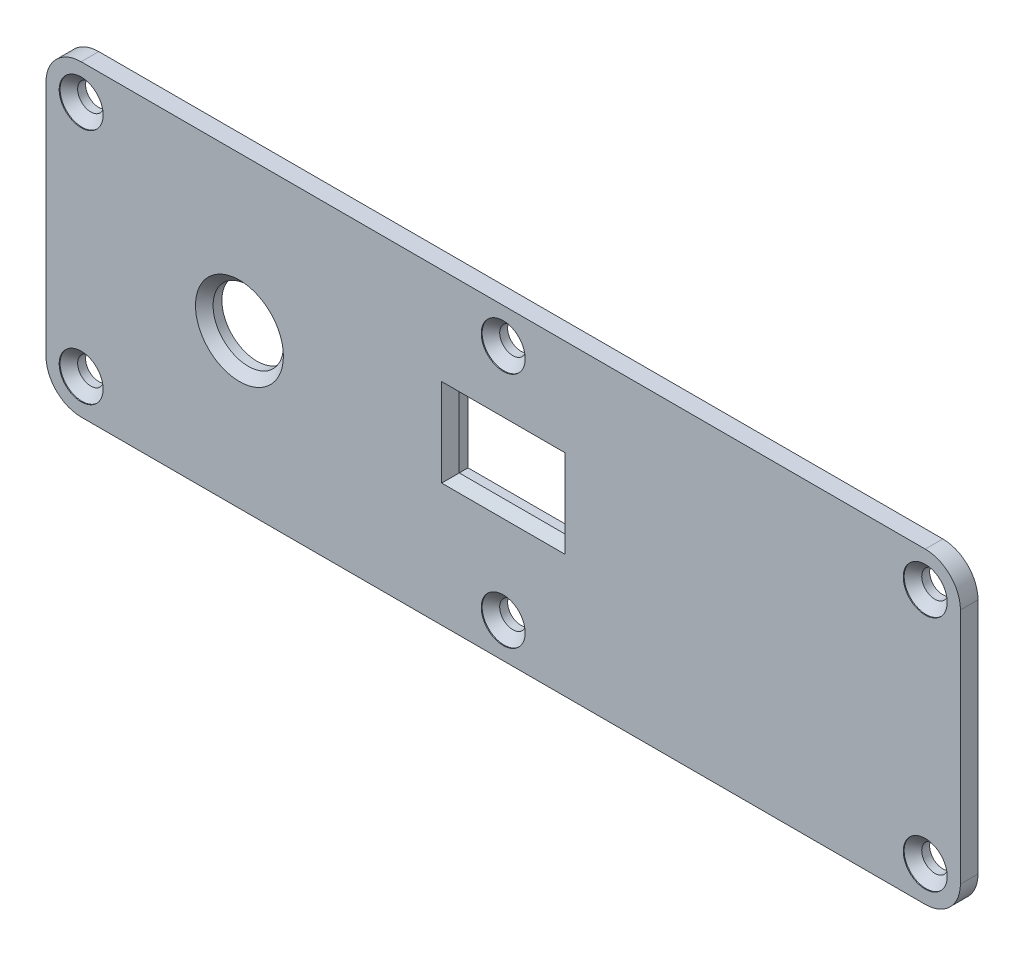
ISO-10303-21;
HEADER;
FILE_DESCRIPTION(('STEP AP214'),'2;1');
FILE_NAME('part.step','',(''),(''),'','','');
FILE_SCHEMA(('AUTOMOTIVE_DESIGN { 1 0 10303 214 1 1 1 1 }'));
ENDSEC;
DATA;
#1=APPLICATION_CONTEXT('core data for automotive mechanical design processes');
#2=APPLICATION_PROTOCOL_DEFINITION('international standard','automotive_design',2000,#1);
#3=PRODUCT_CONTEXT('',#1,'mechanical');
#4=PRODUCT('Part','Part','',(#3));
#5=PRODUCT_RELATED_PRODUCT_CATEGORY('part','',(#4));
#6=PRODUCT_DEFINITION_FORMATION('','',#4);
#7=PRODUCT_DEFINITION_CONTEXT('part definition',#1,'design');
#8=PRODUCT_DEFINITION('design','',#6,#7);
#9=PRODUCT_DEFINITION_SHAPE('','',#8);
#10=(LENGTH_UNIT() NAMED_UNIT(*) SI_UNIT(.MILLI.,.METRE.));
#11=(NAMED_UNIT(*) PLANE_ANGLE_UNIT() SI_UNIT($,.RADIAN.));
#12=(NAMED_UNIT(*) SI_UNIT($,.STERADIAN.) SOLID_ANGLE_UNIT());
#13=UNCERTAINTY_MEASURE_WITH_UNIT(LENGTH_MEASURE(1.E-05),#10,'distance_accuracy_value','');
#14=(GEOMETRIC_REPRESENTATION_CONTEXT(3) GLOBAL_UNCERTAINTY_ASSIGNED_CONTEXT((#13)) GLOBAL_UNIT_ASSIGNED_CONTEXT((#10,
#11,#12)) REPRESENTATION_CONTEXT('',''));
#15=CARTESIAN_POINT('',(0.,0.,0.));
#16=DIRECTION('',(0.,0.,1.));
#17=DIRECTION('',(1.,0.,0.));
#18=AXIS2_PLACEMENT_3D('',#15,#16,#17);
#19=CARTESIAN_POINT('',(-52.,4.00000000000001,0.));
#20=DIRECTION('',(0.,0.,1.));
#21=DIRECTION('',(1.,0.,0.));
#22=AXIS2_PLACEMENT_3D('',#19,#20,#21);
#23=CYLINDRICAL_SURFACE('',#22,1.5);
#24=CARTESIAN_POINT('',(-52.,4.00000000000001,0.900000000000003));
#25=DIRECTION('',(0.,0.,1.));
#26=DIRECTION('',(1.,0.,0.));
#27=AXIS2_PLACEMENT_3D('',#24,#25,#26);
#28=CIRCLE('',#27,1.5);
#29=CARTESIAN_POINT('',(-50.5,4.00000000000001,0.900000000000003));
#30=VERTEX_POINT('',#29);
#31=EDGE_CURVE('E260',#30,#30,#28,.T.);
#32=ORIENTED_EDGE('',*,*,#31,.T.);
#33=EDGE_LOOP('',(#32));
#34=FACE_BOUND('',#33,.T.);
#35=CARTESIAN_POINT('',(-52.,4.00000000000001,0.));
#36=DIRECTION('',(0.,0.,1.));
#37=DIRECTION('',(1.,0.,0.));
#38=AXIS2_PLACEMENT_3D('',#35,#36,#37);
#39=CIRCLE('',#38,1.5);
#40=CARTESIAN_POINT('',(-50.5,4.00000000000001,0.));
#41=VERTEX_POINT('',#40);
#42=EDGE_CURVE('E173',#41,#41,#39,.T.);
#43=ORIENTED_EDGE('',*,*,#42,.F.);
#44=EDGE_LOOP('',(#43));
#45=FACE_BOUND('',#44,.T.);
#46=ADVANCED_FACE('F32',(#34,#45),#23,.F.);
#47=CARTESIAN_POINT('',(-52.,31.,0.));
#48=DIRECTION('',(0.,0.,1.));
#49=DIRECTION('',(1.,0.,0.));
#50=AXIS2_PLACEMENT_3D('',#47,#48,#49);
#51=CYLINDRICAL_SURFACE('',#50,1.5);
#52=CARTESIAN_POINT('',(-52.,31.,0.899999999999989));
#53=DIRECTION('',(0.,0.,1.));
#54=DIRECTION('',(1.,0.,0.));
#55=AXIS2_PLACEMENT_3D('',#52,#53,#54);
#56=CIRCLE('',#55,1.5);
#57=CARTESIAN_POINT('',(-50.5,31.,0.899999999999989));
#58=VERTEX_POINT('',#57);
#59=EDGE_CURVE('E263',#58,#58,#56,.T.);
#60=ORIENTED_EDGE('',*,*,#59,.T.);
#61=EDGE_LOOP('',(#60));
#62=FACE_BOUND('',#61,.T.);
#63=CARTESIAN_POINT('',(-52.,31.,0.));
#64=DIRECTION('',(0.,0.,1.));
#65=DIRECTION('',(1.,0.,0.));
#66=AXIS2_PLACEMENT_3D('',#63,#64,#65);
#67=CIRCLE('',#66,1.5);
#68=CARTESIAN_POINT('',(-50.5,31.,0.));
#69=VERTEX_POINT('',#68);
#70=EDGE_CURVE('E183',#69,#69,#67,.T.);
#71=ORIENTED_EDGE('',*,*,#70,.F.);
#72=EDGE_LOOP('',(#71));
#73=FACE_BOUND('',#72,.T.);
#74=ADVANCED_FACE('F340',(#62,#73),#51,.F.);
#75=CARTESIAN_POINT('',(-100.,31.,0.));
#76=DIRECTION('',(0.,0.,1.));
#77=DIRECTION('',(1.,0.,0.));
#78=AXIS2_PLACEMENT_3D('',#75,#76,#77);
#79=CYLINDRICAL_SURFACE('',#78,1.5);
#80=CARTESIAN_POINT('',(-100.,31.,0.899999999999976));
#81=DIRECTION('',(0.,0.,1.));
#82=DIRECTION('',(1.,0.,0.));
#83=AXIS2_PLACEMENT_3D('',#80,#81,#82);
#84=CIRCLE('',#83,1.5);
#85=CARTESIAN_POINT('',(-98.5,31.,0.899999999999976));
#86=VERTEX_POINT('',#85);
#87=EDGE_CURVE('E257',#86,#86,#84,.T.);
#88=ORIENTED_EDGE('',*,*,#87,.T.);
#89=EDGE_LOOP('',(#88));
#90=FACE_BOUND('',#89,.T.);
#91=CARTESIAN_POINT('',(-100.,31.,0.));
#92=DIRECTION('',(0.,0.,1.));
#93=DIRECTION('',(1.,0.,0.));
#94=AXIS2_PLACEMENT_3D('',#91,#92,#93);
#95=CIRCLE('',#94,1.5);
#96=CARTESIAN_POINT('',(-98.5,31.,0.));
#97=VERTEX_POINT('',#96);
#98=EDGE_CURVE('E216',#97,#97,#95,.T.);
#99=ORIENTED_EDGE('',*,*,#98,.F.);
#100=EDGE_LOOP('',(#99));
#101=FACE_BOUND('',#100,.T.);
#102=ADVANCED_FACE('F346',(#90,#101),#79,.F.);
#103=CARTESIAN_POINT('',(-100.,3.99999999999999,0.));
#104=DIRECTION('',(0.,0.,1.));
#105=DIRECTION('',(1.,0.,0.));
#106=AXIS2_PLACEMENT_3D('',#103,#104,#105);
#107=CYLINDRICAL_SURFACE('',#106,1.5);
#108=CARTESIAN_POINT('',(-100.,3.99999999999999,0.89999999999999));
#109=DIRECTION('',(0.,0.,1.));
#110=DIRECTION('',(1.,0.,0.));
#111=AXIS2_PLACEMENT_3D('',#108,#109,#110);
#112=CIRCLE('',#111,1.5);
#113=CARTESIAN_POINT('',(-98.5,3.99999999999999,0.89999999999999));
#114=VERTEX_POINT('',#113);
#115=EDGE_CURVE('E254',#114,#114,#112,.T.);
#116=ORIENTED_EDGE('',*,*,#115,.T.);
#117=EDGE_LOOP('',(#116));
#118=FACE_BOUND('',#117,.T.);
#119=CARTESIAN_POINT('',(-100.,3.99999999999999,0.));
#120=DIRECTION('',(0.,0.,1.));
#121=DIRECTION('',(1.,0.,0.));
#122=AXIS2_PLACEMENT_3D('',#119,#120,#121);
#123=CIRCLE('',#122,1.5);
#124=CARTESIAN_POINT('',(-98.5,3.99999999999999,0.));
#125=VERTEX_POINT('',#124);
#126=EDGE_CURVE('E213',#125,#125,#123,.T.);
#127=ORIENTED_EDGE('',*,*,#126,.F.);
#128=EDGE_LOOP('',(#127));
#129=FACE_BOUND('',#128,.T.);
#130=ADVANCED_FACE('F370',(#118,#129),#107,.F.);
#131=CARTESIAN_POINT('',(0.,0.,2.));
#132=DIRECTION('',(-1.,0.,0.));
#133=DIRECTION('',(0.,0.,1.));
#134=AXIS2_PLACEMENT_3D('',#131,#132,#133);
#135=PLANE('',#134);
#136=DIRECTION('',(0.,1.,0.));
#137=VECTOR('',#136,1.);
#138=CARTESIAN_POINT('',(0.,0.,2.));
#139=LINE('',#138,#137);
#140=CARTESIAN_POINT('',(0.,4.,2.));
#141=VERTEX_POINT('',#140);
#142=CARTESIAN_POINT('',(0.,31.,2.));
#143=VERTEX_POINT('',#142);
#144=EDGE_CURVE('E225',#141,#143,#139,.T.);
#145=ORIENTED_EDGE('',*,*,#144,.F.);
#146=DIRECTION('',(0.,0.,-1.));
#147=VECTOR('',#146,1.);
#148=CARTESIAN_POINT('',(0.,4.,2.));
#149=LINE('',#148,#147);
#150=CARTESIAN_POINT('',(0.,4.,0.));
#151=VERTEX_POINT('',#150);
#152=EDGE_CURVE('E268',#141,#151,#149,.T.);
#153=ORIENTED_EDGE('',*,*,#152,.T.);
#154=DIRECTION('',(0.,1.,0.));
#155=VECTOR('',#154,1.);
#156=CARTESIAN_POINT('',(0.,0.,0.));
#157=LINE('',#156,#155);
#158=CARTESIAN_POINT('',(0.,31.,0.));
#159=VERTEX_POINT('',#158);
#160=EDGE_CURVE('E224',#151,#159,#157,.T.);
#161=ORIENTED_EDGE('',*,*,#160,.T.);
#162=DIRECTION('',(0.,0.,-1.));
#163=VECTOR('',#162,1.);
#164=CARTESIAN_POINT('',(0.,31.,2.));
#165=LINE('',#164,#163);
#166=EDGE_CURVE('E266',#159,#143,#165,.F.);
#167=ORIENTED_EDGE('',*,*,#166,.T.);
#168=EDGE_LOOP('',(#145,#153,#161,#167));
#169=FACE_BOUND('',#168,.T.);
#170=ADVANCED_FACE('F373',(#169),#135,.F.);
#171=CARTESIAN_POINT('',(0.,35.,2.));
#172=DIRECTION('',(0.,-1.,0.));
#173=DIRECTION('',(1.,0.,0.));
#174=AXIS2_PLACEMENT_3D('',#171,#172,#173);
#175=PLANE('',#174);
#176=DIRECTION('',(-1.,0.,0.));
#177=VECTOR('',#176,1.);
#178=CARTESIAN_POINT('',(0.,35.,2.));
#179=LINE('',#178,#177);
#180=CARTESIAN_POINT('',(-4.,35.,2.));
#181=VERTEX_POINT('',#180);
#182=CARTESIAN_POINT('',(-100.,35.,2.));
#183=VERTEX_POINT('',#182);
#184=EDGE_CURVE('E228',#181,#183,#179,.T.);
#185=ORIENTED_EDGE('',*,*,#184,.F.);
#186=DIRECTION('',(0.,0.,-1.));
#187=VECTOR('',#186,1.);
#188=CARTESIAN_POINT('',(-4.,35.,2.));
#189=LINE('',#188,#187);
#190=CARTESIAN_POINT('',(-4.,35.,0.));
#191=VERTEX_POINT('',#190);
#192=EDGE_CURVE('E294',#181,#191,#189,.T.);
#193=ORIENTED_EDGE('',*,*,#192,.T.);
#194=DIRECTION('',(-1.,0.,0.));
#195=VECTOR('',#194,1.);
#196=CARTESIAN_POINT('',(0.,35.,0.));
#197=LINE('',#196,#195);
#198=CARTESIAN_POINT('',(-100.,35.,0.));
#199=VERTEX_POINT('',#198);
#200=EDGE_CURVE('E241',#191,#199,#197,.T.);
#201=ORIENTED_EDGE('',*,*,#200,.T.);
#202=DIRECTION('',(0.,0.,-1.));
#203=VECTOR('',#202,1.);
#204=CARTESIAN_POINT('',(-100.,35.,2.));
#205=LINE('',#204,#203);
#206=EDGE_CURVE('E292',#199,#183,#205,.F.);
#207=ORIENTED_EDGE('',*,*,#206,.T.);
#208=EDGE_LOOP('',(#185,#193,#201,#207));
#209=FACE_BOUND('',#208,.T.);
#210=ADVANCED_FACE('F399',(#209),#175,.F.);
#211=CARTESIAN_POINT('',(-104.,0.,2.));
#212=DIRECTION('',(1.,0.,0.));
#213=DIRECTION('',(0.,0.,-1.));
#214=AXIS2_PLACEMENT_3D('',#211,#212,#213);
#215=PLANE('',#214);
#216=DIRECTION('',(0.,-1.,0.));
#217=VECTOR('',#216,1.);
#218=CARTESIAN_POINT('',(-104.,0.,0.));
#219=LINE('',#218,#217);
#220=CARTESIAN_POINT('',(-104.,31.,0.));
#221=VERTEX_POINT('',#220);
#222=CARTESIAN_POINT('',(-104.,4.,0.));
#223=VERTEX_POINT('',#222);
#224=EDGE_CURVE('E244',#221,#223,#219,.T.);
#225=ORIENTED_EDGE('',*,*,#224,.T.);
#226=DIRECTION('',(0.,0.,-1.));
#227=VECTOR('',#226,1.);
#228=CARTESIAN_POINT('',(-104.,4.,2.));
#229=LINE('',#228,#227);
#230=CARTESIAN_POINT('',(-104.,4.,2.));
#231=VERTEX_POINT('',#230);
#232=EDGE_CURVE('E300',#223,#231,#229,.F.);
#233=ORIENTED_EDGE('',*,*,#232,.T.);
#234=DIRECTION('',(0.,-1.,0.));
#235=VECTOR('',#234,1.);
#236=CARTESIAN_POINT('',(-104.,0.,2.));
#237=LINE('',#236,#235);
#238=CARTESIAN_POINT('',(-104.,31.,2.));
#239=VERTEX_POINT('',#238);
#240=EDGE_CURVE('E232',#239,#231,#237,.T.);
#241=ORIENTED_EDGE('',*,*,#240,.F.);
#242=DIRECTION('',(0.,0.,-1.));
#243=VECTOR('',#242,1.);
#244=CARTESIAN_POINT('',(-104.,31.,2.));
#245=LINE('',#244,#243);
#246=EDGE_CURVE('E297',#239,#221,#245,.T.);
#247=ORIENTED_EDGE('',*,*,#246,.T.);
#248=EDGE_LOOP('',(#225,#233,#241,#247));
#249=FACE_BOUND('',#248,.T.);
#250=ADVANCED_FACE('F395',(#249),#215,.F.);
#251=CARTESIAN_POINT('',(0.,0.,2.));
#252=DIRECTION('',(0.,1.,0.));
#253=DIRECTION('',(0.,0.,1.));
#254=AXIS2_PLACEMENT_3D('',#251,#252,#253);
#255=PLANE('',#254);
#256=DIRECTION('',(1.,0.,0.));
#257=VECTOR('',#256,1.);
#258=CARTESIAN_POINT('',(0.,0.,0.));
#259=LINE('',#258,#257);
#260=CARTESIAN_POINT('',(-100.,0.,0.));
#261=VERTEX_POINT('',#260);
#262=CARTESIAN_POINT('',(-4.,0.,0.));
#263=VERTEX_POINT('',#262);
#264=EDGE_CURVE('E229',#261,#263,#259,.T.);
#265=ORIENTED_EDGE('',*,*,#264,.T.);
#266=DIRECTION('',(0.,0.,-1.));
#267=VECTOR('',#266,1.);
#268=CARTESIAN_POINT('',(-4.,0.,2.));
#269=LINE('',#268,#267);
#270=CARTESIAN_POINT('',(-4.,0.,2.));
#271=VERTEX_POINT('',#270);
#272=EDGE_CURVE('E282',#263,#271,#269,.F.);
#273=ORIENTED_EDGE('',*,*,#272,.T.);
#274=DIRECTION('',(1.,0.,0.));
#275=VECTOR('',#274,1.);
#276=CARTESIAN_POINT('',(0.,0.,2.));
#277=LINE('',#276,#275);
#278=CARTESIAN_POINT('',(-100.,0.,2.));
#279=VERTEX_POINT('',#278);
#280=EDGE_CURVE('E235',#279,#271,#277,.T.);
#281=ORIENTED_EDGE('',*,*,#280,.F.);
#282=DIRECTION('',(0.,0.,-1.));
#283=VECTOR('',#282,1.);
#284=CARTESIAN_POINT('',(-100.,0.,2.));
#285=LINE('',#284,#283);
#286=EDGE_CURVE('E279',#279,#261,#285,.T.);
#287=ORIENTED_EDGE('',*,*,#286,.T.);
#288=EDGE_LOOP('',(#265,#273,#281,#287));
#289=FACE_BOUND('',#288,.T.);
#290=ADVANCED_FACE('F388',(#289),#255,.F.);
#291=CARTESIAN_POINT('',(0.,0.,2.));
#292=DIRECTION('',(0.,0.,1.));
#293=DIRECTION('',(1.,0.,0.));
#294=AXIS2_PLACEMENT_3D('',#291,#292,#293);
#295=PLANE('',#294);
#296=CARTESIAN_POINT('',(-82.,17.5,2.));
#297=DIRECTION('',(0.,0.,1.));
#298=DIRECTION('',(1.,0.,0.));
#299=AXIS2_PLACEMENT_3D('',#296,#297,#298);
#300=CIRCLE('',#299,4.99999999999999);
#301=CARTESIAN_POINT('',(-77.,17.5,2.));
#302=VERTEX_POINT('',#301);
#303=EDGE_CURVE('E11',#302,#302,#300,.F.);
#304=ORIENTED_EDGE('',*,*,#303,.T.);
#305=EDGE_LOOP('',(#304));
#306=FACE_BOUND('',#305,.T.);
#307=DIRECTION('',(1.,0.,0.));
#308=VECTOR('',#307,1.);
#309=CARTESIAN_POINT('',(-46.,24.,2.));
#310=LINE('',#309,#308);
#311=CARTESIAN_POINT('',(-59.,24.,2.));
#312=VERTEX_POINT('',#311);
#313=CARTESIAN_POINT('',(-45.,24.,2.));
#314=VERTEX_POINT('',#313);
#315=EDGE_CURVE('E305',#312,#314,#310,.T.);
#316=ORIENTED_EDGE('',*,*,#315,.T.);
#317=DIRECTION('',(0.,-1.,0.));
#318=VECTOR('',#317,1.);
#319=CARTESIAN_POINT('',(-45.,15.,2.));
#320=LINE('',#319,#318);
#321=CARTESIAN_POINT('',(-45.,14.,2.));
#322=VERTEX_POINT('',#321);
#323=EDGE_CURVE('E311',#314,#322,#320,.T.);
#324=ORIENTED_EDGE('',*,*,#323,.T.);
#325=DIRECTION('',(-1.,0.,0.));
#326=VECTOR('',#325,1.);
#327=CARTESIAN_POINT('',(-58.,14.,2.));
#328=LINE('',#327,#326);
#329=CARTESIAN_POINT('',(-59.,14.,2.));
#330=VERTEX_POINT('',#329);
#331=EDGE_CURVE('E309',#322,#330,#328,.T.);
#332=ORIENTED_EDGE('',*,*,#331,.T.);
#333=DIRECTION('',(0.,1.,0.));
#334=VECTOR('',#333,1.);
#335=CARTESIAN_POINT('',(-59.,23.,2.));
#336=LINE('',#335,#334);
#337=EDGE_CURVE('E307',#330,#312,#336,.T.);
#338=ORIENTED_EDGE('',*,*,#337,.T.);
#339=EDGE_LOOP('',(#316,#324,#332,#338));
#340=FACE_BOUND('',#339,.T.);
#341=CARTESIAN_POINT('',(-52.,31.,2.));
#342=DIRECTION('',(0.,0.,1.));
#343=DIRECTION('',(1.,0.,0.));
#344=AXIS2_PLACEMENT_3D('',#341,#342,#343);
#345=CIRCLE('',#344,2.5);
#346=CARTESIAN_POINT('',(-49.5,31.,2.));
#347=VERTEX_POINT('',#346);
#348=EDGE_CURVE('E174',#347,#347,#345,.T.);
#349=ORIENTED_EDGE('',*,*,#348,.F.);
#350=EDGE_LOOP('',(#349));
#351=FACE_BOUND('',#350,.T.);
#352=CARTESIAN_POINT('',(-52.,4.00000000000001,2.));
#353=DIRECTION('',(0.,0.,1.));
#354=DIRECTION('',(1.,0.,0.));
#355=AXIS2_PLACEMENT_3D('',#352,#353,#354);
#356=CIRCLE('',#355,2.5);
#357=CARTESIAN_POINT('',(-49.5,4.00000000000001,2.));
#358=VERTEX_POINT('',#357);
#359=EDGE_CURVE('E180',#358,#358,#356,.T.);
#360=ORIENTED_EDGE('',*,*,#359,.F.);
#361=EDGE_LOOP('',(#360));
#362=FACE_BOUND('',#361,.T.);
#363=CARTESIAN_POINT('',(-3.99999999999998,30.9999999999999,2.));
#364=DIRECTION('',(0.,0.,1.));
#365=DIRECTION('',(-1.,0.,0.));
#366=AXIS2_PLACEMENT_3D('',#363,#364,#365);
#367=CIRCLE('',#366,2.50000000000001);
#368=CARTESIAN_POINT('',(-6.49999999999999,30.9999999999999,2.));
#369=VERTEX_POINT('',#368);
#370=EDGE_CURVE('E186',#369,#369,#367,.T.);
#371=ORIENTED_EDGE('',*,*,#370,.F.);
#372=EDGE_LOOP('',(#371));
#373=FACE_BOUND('',#372,.T.);
#374=CARTESIAN_POINT('',(-4.00000000000003,3.99999999999992,2.));
#375=DIRECTION('',(0.,0.,1.));
#376=DIRECTION('',(-1.,0.,0.));
#377=AXIS2_PLACEMENT_3D('',#374,#375,#376);
#378=CIRCLE('',#377,2.5);
#379=CARTESIAN_POINT('',(-6.50000000000003,3.99999999999992,2.));
#380=VERTEX_POINT('',#379);
#381=EDGE_CURVE('E199',#380,#380,#378,.T.);
#382=ORIENTED_EDGE('',*,*,#381,.F.);
#383=EDGE_LOOP('',(#382));
#384=FACE_BOUND('',#383,.T.);
#385=CARTESIAN_POINT('',(-100.,3.99999999999999,2.));
#386=DIRECTION('',(0.,0.,1.));
#387=DIRECTION('',(1.,0.,0.));
#388=AXIS2_PLACEMENT_3D('',#385,#386,#387);
#389=CIRCLE('',#388,2.50000000000001);
#390=CARTESIAN_POINT('',(-97.5,3.99999999999999,2.));
#391=VERTEX_POINT('',#390);
#392=EDGE_CURVE('E193',#391,#391,#389,.T.);
#393=ORIENTED_EDGE('',*,*,#392,.F.);
#394=EDGE_LOOP('',(#393));
#395=FACE_BOUND('',#394,.T.);
#396=CARTESIAN_POINT('',(-100.,31.,2.));
#397=DIRECTION('',(0.,0.,1.));
#398=DIRECTION('',(1.,0.,0.));
#399=AXIS2_PLACEMENT_3D('',#396,#397,#398);
#400=CIRCLE('',#399,2.50000000000001);
#401=CARTESIAN_POINT('',(-97.5,31.,2.));
#402=VERTEX_POINT('',#401);
#403=EDGE_CURVE('E192',#402,#402,#400,.T.);
#404=ORIENTED_EDGE('',*,*,#403,.F.);
#405=EDGE_LOOP('',(#404));
#406=FACE_BOUND('',#405,.T.);
#407=ORIENTED_EDGE('',*,*,#280,.T.);
#408=CARTESIAN_POINT('',(-4.,4.,2.));
#409=DIRECTION('',(0.,0.,1.));
#410=DIRECTION('',(1.,0.,0.));
#411=AXIS2_PLACEMENT_3D('',#408,#409,#410);
#412=CIRCLE('',#411,4.);
#413=EDGE_CURVE('E290',#271,#141,#412,.T.);
#414=ORIENTED_EDGE('',*,*,#413,.T.);
#415=ORIENTED_EDGE('',*,*,#144,.T.);
#416=CARTESIAN_POINT('',(-4.,31.,2.));
#417=DIRECTION('',(0.,0.,1.));
#418=DIRECTION('',(1.,0.,0.));
#419=AXIS2_PLACEMENT_3D('',#416,#417,#418);
#420=CIRCLE('',#419,4.);
#421=EDGE_CURVE('E288',#143,#181,#420,.T.);
#422=ORIENTED_EDGE('',*,*,#421,.T.);
#423=ORIENTED_EDGE('',*,*,#184,.T.);
#424=CARTESIAN_POINT('',(-100.,31.,2.));
#425=DIRECTION('',(0.,0.,1.));
#426=DIRECTION('',(1.,0.,0.));
#427=AXIS2_PLACEMENT_3D('',#424,#425,#426);
#428=CIRCLE('',#427,4.);
#429=EDGE_CURVE('E284',#183,#239,#428,.T.);
#430=ORIENTED_EDGE('',*,*,#429,.T.);
#431=ORIENTED_EDGE('',*,*,#240,.T.);
#432=CARTESIAN_POINT('',(-100.,4.,2.));
#433=DIRECTION('',(0.,0.,1.));
#434=DIRECTION('',(1.,0.,0.));
#435=AXIS2_PLACEMENT_3D('',#432,#433,#434);
#436=CIRCLE('',#435,4.);
#437=EDGE_CURVE('E286',#231,#279,#436,.T.);
#438=ORIENTED_EDGE('',*,*,#437,.T.);
#439=EDGE_LOOP('',(#407,#414,#415,#422,#423,#430,#431,#438));
#440=FACE_BOUND('',#439,.T.);
#441=ADVANCED_FACE('F385',(#306,#340,#351,#362,#373,#384,#395,#406,#440),#295,.T.);
#442=CARTESIAN_POINT('',(0.,0.,0.));
#443=DIRECTION('',(0.,0.,1.));
#444=DIRECTION('',(1.,0.,0.));
#445=AXIS2_PLACEMENT_3D('',#442,#443,#444);
#446=PLANE('',#445);
#447=CARTESIAN_POINT('',(-82.,17.5,0.));
#448=DIRECTION('',(0.,0.,1.));
#449=DIRECTION('',(1.,0.,0.));
#450=AXIS2_PLACEMENT_3D('',#447,#448,#449);
#451=CIRCLE('',#450,4.00000000000001);
#452=CARTESIAN_POINT('',(-78.,17.5,0.));
#453=VERTEX_POINT('',#452);
#454=EDGE_CURVE('E161',#453,#453,#451,.T.);
#455=ORIENTED_EDGE('',*,*,#454,.T.);
#456=EDGE_LOOP('',(#455));
#457=FACE_BOUND('',#456,.T.);
#458=DIRECTION('',(-1.,0.,0.));
#459=VECTOR('',#458,1.);
#460=CARTESIAN_POINT('',(-58.,23.,0.));
#461=LINE('',#460,#459);
#462=CARTESIAN_POINT('',(-46.,23.,0.));
#463=VERTEX_POINT('',#462);
#464=CARTESIAN_POINT('',(-58.,23.,0.));
#465=VERTEX_POINT('',#464);
#466=EDGE_CURVE('E141',#463,#465,#461,.T.);
#467=ORIENTED_EDGE('',*,*,#466,.T.);
#468=DIRECTION('',(0.,-1.,0.));
#469=VECTOR('',#468,1.);
#470=CARTESIAN_POINT('',(-58.,23.,0.));
#471=LINE('',#470,#469);
#472=CARTESIAN_POINT('',(-58.,15.,0.));
#473=VERTEX_POINT('',#472);
#474=EDGE_CURVE('E136',#465,#473,#471,.T.);
#475=ORIENTED_EDGE('',*,*,#474,.T.);
#476=DIRECTION('',(1.,0.,0.));
#477=VECTOR('',#476,1.);
#478=CARTESIAN_POINT('',(-58.,15.,0.));
#479=LINE('',#478,#477);
#480=CARTESIAN_POINT('',(-46.,15.,0.));
#481=VERTEX_POINT('',#480);
#482=EDGE_CURVE('E145',#473,#481,#479,.T.);
#483=ORIENTED_EDGE('',*,*,#482,.T.);
#484=DIRECTION('',(0.,1.,0.));
#485=VECTOR('',#484,1.);
#486=CARTESIAN_POINT('',(-46.,23.,0.));
#487=LINE('',#486,#485);
#488=EDGE_CURVE('E150',#481,#463,#487,.T.);
#489=ORIENTED_EDGE('',*,*,#488,.T.);
#490=EDGE_LOOP('',(#467,#475,#483,#489));
#491=FACE_BOUND('',#490,.T.);
#492=ORIENTED_EDGE('',*,*,#70,.T.);
#493=EDGE_LOOP('',(#492));
#494=FACE_BOUND('',#493,.T.);
#495=ORIENTED_EDGE('',*,*,#42,.T.);
#496=EDGE_LOOP('',(#495));
#497=FACE_BOUND('',#496,.T.);
#498=CARTESIAN_POINT('',(-4.,31.,0.));
#499=DIRECTION('',(0.,0.,1.));
#500=DIRECTION('',(-1.,0.,0.));
#501=AXIS2_PLACEMENT_3D('',#498,#499,#500);
#502=CIRCLE('',#501,1.5);
#503=CARTESIAN_POINT('',(-5.5,31.,0.));
#504=VERTEX_POINT('',#503);
#505=EDGE_CURVE('E210',#504,#504,#502,.T.);
#506=ORIENTED_EDGE('',*,*,#505,.T.);
#507=EDGE_LOOP('',(#506));
#508=FACE_BOUND('',#507,.T.);
#509=CARTESIAN_POINT('',(-3.99999999999999,4.00000000000001,0.));
#510=DIRECTION('',(0.,0.,1.));
#511=DIRECTION('',(-1.,0.,0.));
#512=AXIS2_PLACEMENT_3D('',#509,#510,#511);
#513=CIRCLE('',#512,1.49999999999998);
#514=CARTESIAN_POINT('',(-5.49999999999997,4.00000000000001,0.));
#515=VERTEX_POINT('',#514);
#516=EDGE_CURVE('E217',#515,#515,#513,.T.);
#517=ORIENTED_EDGE('',*,*,#516,.T.);
#518=EDGE_LOOP('',(#517));
#519=FACE_BOUND('',#518,.T.);
#520=ORIENTED_EDGE('',*,*,#126,.T.);
#521=EDGE_LOOP('',(#520));
#522=FACE_BOUND('',#521,.T.);
#523=ORIENTED_EDGE('',*,*,#98,.T.);
#524=EDGE_LOOP('',(#523));
#525=FACE_BOUND('',#524,.T.);
#526=ORIENTED_EDGE('',*,*,#160,.F.);
#527=CARTESIAN_POINT('',(-4.,4.,0.));
#528=DIRECTION('',(0.,0.,1.));
#529=DIRECTION('',(1.,0.,0.));
#530=AXIS2_PLACEMENT_3D('',#527,#528,#529);
#531=CIRCLE('',#530,4.);
#532=EDGE_CURVE('E277',#151,#263,#531,.F.);
#533=ORIENTED_EDGE('',*,*,#532,.T.);
#534=ORIENTED_EDGE('',*,*,#264,.F.);
#535=CARTESIAN_POINT('',(-100.,4.,0.));
#536=DIRECTION('',(0.,0.,1.));
#537=DIRECTION('',(1.,0.,0.));
#538=AXIS2_PLACEMENT_3D('',#535,#536,#537);
#539=CIRCLE('',#538,4.);
#540=EDGE_CURVE('E273',#261,#223,#539,.F.);
#541=ORIENTED_EDGE('',*,*,#540,.T.);
#542=ORIENTED_EDGE('',*,*,#224,.F.);
#543=CARTESIAN_POINT('',(-100.,31.,0.));
#544=DIRECTION('',(0.,0.,1.));
#545=DIRECTION('',(1.,0.,0.));
#546=AXIS2_PLACEMENT_3D('',#543,#544,#545);
#547=CIRCLE('',#546,4.);
#548=EDGE_CURVE('E271',#221,#199,#547,.F.);
#549=ORIENTED_EDGE('',*,*,#548,.T.);
#550=ORIENTED_EDGE('',*,*,#200,.F.);
#551=CARTESIAN_POINT('',(-4.,31.,0.));
#552=DIRECTION('',(0.,0.,1.));
#553=DIRECTION('',(1.,0.,0.));
#554=AXIS2_PLACEMENT_3D('',#551,#552,#553);
#555=CIRCLE('',#554,4.);
#556=EDGE_CURVE('E275',#191,#159,#555,.F.);
#557=ORIENTED_EDGE('',*,*,#556,.T.);
#558=EDGE_LOOP('',(#526,#533,#534,#541,#542,#549,#550,#557));
#559=FACE_BOUND('',#558,.T.);
#560=ADVANCED_FACE('F152',(#457,#491,#494,#497,#508,#519,#522,#525,#559),#446,.F.);
#561=CARTESIAN_POINT('',(-3.99999999999999,4.00000000000001,0.));
#562=DIRECTION('',(0.,0.,1.));
#563=DIRECTION('',(1.,0.,0.));
#564=AXIS2_PLACEMENT_3D('',#561,#562,#563);
#565=CYLINDRICAL_SURFACE('',#564,1.49999999999998);
#566=CARTESIAN_POINT('',(-3.99999999999999,4.00000000000001,0.89999999999999));
#567=DIRECTION('',(0.,0.,-1.));
#568=DIRECTION('',(-1.,0.,0.));
#569=AXIS2_PLACEMENT_3D('',#566,#567,#568);
#570=CIRCLE('',#569,1.49999999999998);
#571=CARTESIAN_POINT('',(-5.49999999999997,4.00000000000001,0.89999999999999));
#572=VERTEX_POINT('',#571);
#573=EDGE_CURVE('E238',#572,#572,#570,.F.);
#574=ORIENTED_EDGE('',*,*,#573,.T.);
#575=EDGE_LOOP('',(#574));
#576=FACE_BOUND('',#575,.T.);
#577=ORIENTED_EDGE('',*,*,#516,.F.);
#578=EDGE_LOOP('',(#577));
#579=FACE_BOUND('',#578,.T.);
#580=ADVANCED_FACE('F375',(#576,#579),#565,.F.);
#581=CARTESIAN_POINT('',(-4.,31.,0.));
#582=DIRECTION('',(0.,0.,1.));
#583=DIRECTION('',(1.,0.,0.));
#584=AXIS2_PLACEMENT_3D('',#581,#582,#583);
#585=CYLINDRICAL_SURFACE('',#584,1.5);
#586=CARTESIAN_POINT('',(-4.,31.,0.900000000000003));
#587=DIRECTION('',(0.,0.,-1.));
#588=DIRECTION('',(-1.,0.,0.));
#589=AXIS2_PLACEMENT_3D('',#586,#587,#588);
#590=CIRCLE('',#589,1.5);
#591=CARTESIAN_POINT('',(-5.5,31.,0.900000000000003));
#592=VERTEX_POINT('',#591);
#593=EDGE_CURVE('E251',#592,#592,#590,.F.);
#594=ORIENTED_EDGE('',*,*,#593,.T.);
#595=EDGE_LOOP('',(#594));
#596=FACE_BOUND('',#595,.T.);
#597=ORIENTED_EDGE('',*,*,#505,.F.);
#598=EDGE_LOOP('',(#597));
#599=FACE_BOUND('',#598,.T.);
#600=ADVANCED_FACE('F364',(#596,#599),#585,.F.);
#601=CARTESIAN_POINT('',(-3.99999999999998,30.9999999999999,1.9));
#602=DIRECTION('',(0.,0.,1.));
#603=DIRECTION('',(1.,0.,0.));
#604=AXIS2_PLACEMENT_3D('',#601,#602,#603);
#605=CYLINDRICAL_SURFACE('',#604,2.50000000000001);
#606=CARTESIAN_POINT('',(-3.99999999999998,30.9999999999999,1.9));
#607=DIRECTION('',(0.,0.,1.));
#608=DIRECTION('',(-1.,0.,0.));
#609=AXIS2_PLACEMENT_3D('',#606,#607,#608);
#610=CIRCLE('',#609,2.50000000000001);
#611=CARTESIAN_POINT('',(-6.49999999999999,30.9999999999999,1.9));
#612=VERTEX_POINT('',#611);
#613=EDGE_CURVE('E202',#612,#612,#610,.T.);
#614=ORIENTED_EDGE('',*,*,#613,.F.);
#615=EDGE_LOOP('',(#614));
#616=FACE_BOUND('',#615,.T.);
#617=ORIENTED_EDGE('',*,*,#370,.T.);
#618=EDGE_LOOP('',(#617));
#619=FACE_BOUND('',#618,.T.);
#620=ADVANCED_FACE('F360',(#616,#619),#605,.F.);
#621=CARTESIAN_POINT('',(-4.00000000000003,3.99999999999992,1.9));
#622=DIRECTION('',(0.,0.,1.));
#623=DIRECTION('',(1.,0.,0.));
#624=AXIS2_PLACEMENT_3D('',#621,#622,#623);
#625=CYLINDRICAL_SURFACE('',#624,2.5);
#626=CARTESIAN_POINT('',(-4.00000000000003,3.99999999999992,1.9));
#627=DIRECTION('',(0.,0.,1.));
#628=DIRECTION('',(-1.,0.,0.));
#629=AXIS2_PLACEMENT_3D('',#626,#627,#628);
#630=CIRCLE('',#629,2.5);
#631=CARTESIAN_POINT('',(-6.50000000000003,3.99999999999992,1.9));
#632=VERTEX_POINT('',#631);
#633=EDGE_CURVE('E196',#632,#632,#630,.T.);
#634=ORIENTED_EDGE('',*,*,#633,.F.);
#635=EDGE_LOOP('',(#634));
#636=FACE_BOUND('',#635,.T.);
#637=ORIENTED_EDGE('',*,*,#381,.T.);
#638=EDGE_LOOP('',(#637));
#639=FACE_BOUND('',#638,.T.);
#640=ADVANCED_FACE('F356',(#636,#639),#625,.F.);
#641=CARTESIAN_POINT('',(-100.,3.99999999999999,1.9));
#642=DIRECTION('',(0.,0.,1.));
#643=DIRECTION('',(1.,0.,0.));
#644=AXIS2_PLACEMENT_3D('',#641,#642,#643);
#645=CYLINDRICAL_SURFACE('',#644,2.50000000000001);
#646=CARTESIAN_POINT('',(-100.,3.99999999999999,1.9));
#647=DIRECTION('',(0.,0.,1.));
#648=DIRECTION('',(1.,0.,0.));
#649=AXIS2_PLACEMENT_3D('',#646,#647,#648);
#650=CIRCLE('',#649,2.50000000000001);
#651=CARTESIAN_POINT('',(-97.5,3.99999999999999,1.9));
#652=VERTEX_POINT('',#651);
#653=EDGE_CURVE('E189',#652,#652,#650,.T.);
#654=ORIENTED_EDGE('',*,*,#653,.F.);
#655=EDGE_LOOP('',(#654));
#656=FACE_BOUND('',#655,.T.);
#657=ORIENTED_EDGE('',*,*,#392,.T.);
#658=EDGE_LOOP('',(#657));
#659=FACE_BOUND('',#658,.T.);
#660=ADVANCED_FACE('F352',(#656,#659),#645,.F.);
#661=CARTESIAN_POINT('',(-100.,31.,1.9));
#662=DIRECTION('',(0.,0.,1.));
#663=DIRECTION('',(1.,0.,0.));
#664=AXIS2_PLACEMENT_3D('',#661,#662,#663);
#665=CYLINDRICAL_SURFACE('',#664,2.50000000000001);
#666=CARTESIAN_POINT('',(-100.,31.,1.9));
#667=DIRECTION('',(0.,0.,1.));
#668=DIRECTION('',(1.,0.,0.));
#669=AXIS2_PLACEMENT_3D('',#666,#667,#668);
#670=CIRCLE('',#669,2.50000000000001);
#671=CARTESIAN_POINT('',(-97.5,31.,1.9));
#672=VERTEX_POINT('',#671);
#673=EDGE_CURVE('E207',#672,#672,#670,.T.);
#674=ORIENTED_EDGE('',*,*,#673,.F.);
#675=EDGE_LOOP('',(#674));
#676=FACE_BOUND('',#675,.T.);
#677=ORIENTED_EDGE('',*,*,#403,.T.);
#678=EDGE_LOOP('',(#677));
#679=FACE_BOUND('',#678,.T.);
#680=ADVANCED_FACE('F355',(#676,#679),#665,.F.);
#681=CARTESIAN_POINT('',(-3.99999999999999,4.00000000000001,0.899999999999991));
#682=DIRECTION('',(0.,0.,1.));
#683=DIRECTION('',(1.,0.,0.));
#684=AXIS2_PLACEMENT_3D('',#681,#682,#683);
#685=CONICAL_SURFACE('',#684,1.49999999999998,0.785398163397453);
#686=ORIENTED_EDGE('',*,*,#633,.T.);
#687=EDGE_LOOP('',(#686));
#688=FACE_BOUND('',#687,.T.);
#689=ORIENTED_EDGE('',*,*,#573,.F.);
#690=EDGE_LOOP('',(#689));
#691=FACE_BOUND('',#690,.T.);
#692=ADVANCED_FACE('F368',(#688,#691),#685,.F.);
#693=CARTESIAN_POINT('',(-4.,31.,0.900000000000003));
#694=DIRECTION('',(0.,0.,1.));
#695=DIRECTION('',(1.,0.,0.));
#696=AXIS2_PLACEMENT_3D('',#693,#694,#695);
#697=CONICAL_SURFACE('',#696,1.5,0.785398163397453);
#698=ORIENTED_EDGE('',*,*,#613,.T.);
#699=EDGE_LOOP('',(#698));
#700=FACE_BOUND('',#699,.T.);
#701=ORIENTED_EDGE('',*,*,#593,.F.);
#702=EDGE_LOOP('',(#701));
#703=FACE_BOUND('',#702,.T.);
#704=ADVANCED_FACE('F409',(#700,#703),#697,.F.);
#705=CARTESIAN_POINT('',(-100.,3.99999999999999,1.9));
#706=DIRECTION('',(0.,0.,1.));
#707=DIRECTION('',(1.,0.,0.));
#708=AXIS2_PLACEMENT_3D('',#705,#706,#707);
#709=CONICAL_SURFACE('',#708,2.50000000000002,0.785398163397452);
#710=ORIENTED_EDGE('',*,*,#115,.F.);
#711=EDGE_LOOP('',(#710));
#712=FACE_BOUND('',#711,.T.);
#713=ORIENTED_EDGE('',*,*,#653,.T.);
#714=EDGE_LOOP('',(#713));
#715=FACE_BOUND('',#714,.T.);
#716=ADVANCED_FACE('F413',(#712,#715),#709,.F.);
#717=CARTESIAN_POINT('',(-100.,31.,1.9));
#718=DIRECTION('',(0.,0.,1.));
#719=DIRECTION('',(1.,0.,0.));
#720=AXIS2_PLACEMENT_3D('',#717,#718,#719);
#721=CONICAL_SURFACE('',#720,2.50000000000003,0.785398163397453);
#722=ORIENTED_EDGE('',*,*,#87,.F.);
#723=EDGE_LOOP('',(#722));
#724=FACE_BOUND('',#723,.T.);
#725=ORIENTED_EDGE('',*,*,#673,.T.);
#726=EDGE_LOOP('',(#725));
#727=FACE_BOUND('',#726,.T.);
#728=ADVANCED_FACE('F417',(#724,#727),#721,.F.);
#729=CARTESIAN_POINT('',(-52.,31.,1.9));
#730=DIRECTION('',(0.,0.,1.));
#731=DIRECTION('',(1.,0.,0.));
#732=AXIS2_PLACEMENT_3D('',#729,#730,#731);
#733=CYLINDRICAL_SURFACE('',#732,2.5);
#734=CARTESIAN_POINT('',(-52.,31.,1.9));
#735=DIRECTION('',(0.,0.,1.));
#736=DIRECTION('',(1.,0.,0.));
#737=AXIS2_PLACEMENT_3D('',#734,#735,#736);
#738=CIRCLE('',#737,2.5);
#739=CARTESIAN_POINT('',(-49.5,31.,1.9));
#740=VERTEX_POINT('',#739);
#741=EDGE_CURVE('E170',#740,#740,#738,.T.);
#742=ORIENTED_EDGE('',*,*,#741,.F.);
#743=EDGE_LOOP('',(#742));
#744=FACE_BOUND('',#743,.T.);
#745=ORIENTED_EDGE('',*,*,#348,.T.);
#746=EDGE_LOOP('',(#745));
#747=FACE_BOUND('',#746,.T.);
#748=ADVANCED_FACE('F421',(#744,#747),#733,.F.);
#749=CARTESIAN_POINT('',(-52.,4.00000000000001,1.9));
#750=DIRECTION('',(0.,0.,1.));
#751=DIRECTION('',(1.,0.,0.));
#752=AXIS2_PLACEMENT_3D('',#749,#750,#751);
#753=CYLINDRICAL_SURFACE('',#752,2.5);
#754=CARTESIAN_POINT('',(-52.,4.00000000000001,1.9));
#755=DIRECTION('',(0.,0.,1.));
#756=DIRECTION('',(1.,0.,0.));
#757=AXIS2_PLACEMENT_3D('',#754,#755,#756);
#758=CIRCLE('',#757,2.5);
#759=CARTESIAN_POINT('',(-49.5,4.00000000000001,1.9));
#760=VERTEX_POINT('',#759);
#761=EDGE_CURVE('E177',#760,#760,#758,.T.);
#762=ORIENTED_EDGE('',*,*,#761,.F.);
#763=EDGE_LOOP('',(#762));
#764=FACE_BOUND('',#763,.T.);
#765=ORIENTED_EDGE('',*,*,#359,.T.);
#766=EDGE_LOOP('',(#765));
#767=FACE_BOUND('',#766,.T.);
#768=ADVANCED_FACE('F427',(#764,#767),#753,.F.);
#769=CARTESIAN_POINT('',(-52.,4.00000000000001,1.9));
#770=DIRECTION('',(0.,0.,1.));
#771=DIRECTION('',(1.,0.,0.));
#772=AXIS2_PLACEMENT_3D('',#769,#770,#771);
#773=CONICAL_SURFACE('',#772,2.49999999999999,0.785398163397442);
#774=ORIENTED_EDGE('',*,*,#31,.F.);
#775=EDGE_LOOP('',(#774));
#776=FACE_BOUND('',#775,.T.);
#777=ORIENTED_EDGE('',*,*,#761,.T.);
#778=EDGE_LOOP('',(#777));
#779=FACE_BOUND('',#778,.T.);
#780=ADVANCED_FACE('F423',(#776,#779),#773,.F.);
#781=CARTESIAN_POINT('',(-52.,31.,1.9));
#782=DIRECTION('',(0.,0.,1.));
#783=DIRECTION('',(1.,0.,0.));
#784=AXIS2_PLACEMENT_3D('',#781,#782,#783);
#785=CONICAL_SURFACE('',#784,2.5,0.785398163397442);
#786=ORIENTED_EDGE('',*,*,#59,.F.);
#787=EDGE_LOOP('',(#786));
#788=FACE_BOUND('',#787,.T.);
#789=ORIENTED_EDGE('',*,*,#741,.T.);
#790=EDGE_LOOP('',(#789));
#791=FACE_BOUND('',#790,.T.);
#792=ADVANCED_FACE('F426',(#788,#791),#785,.F.);
#793=CARTESIAN_POINT('',(-4.,4.,2.));
#794=DIRECTION('',(0.,0.,-1.));
#795=DIRECTION('',(-1.,0.,0.));
#796=AXIS2_PLACEMENT_3D('',#793,#794,#795);
#797=CYLINDRICAL_SURFACE('',#796,4.);
#798=ORIENTED_EDGE('',*,*,#413,.F.);
#799=ORIENTED_EDGE('',*,*,#272,.F.);
#800=ORIENTED_EDGE('',*,*,#532,.F.);
#801=ORIENTED_EDGE('',*,*,#152,.F.);
#802=EDGE_LOOP('',(#798,#799,#800,#801));
#803=FACE_BOUND('',#802,.T.);
#804=ADVANCED_FACE('F431',(#803),#797,.T.);
#805=CARTESIAN_POINT('',(-4.,31.,2.));
#806=DIRECTION('',(0.,0.,-1.));
#807=DIRECTION('',(-1.,0.,0.));
#808=AXIS2_PLACEMENT_3D('',#805,#806,#807);
#809=CYLINDRICAL_SURFACE('',#808,4.);
#810=ORIENTED_EDGE('',*,*,#421,.F.);
#811=ORIENTED_EDGE('',*,*,#166,.F.);
#812=ORIENTED_EDGE('',*,*,#556,.F.);
#813=ORIENTED_EDGE('',*,*,#192,.F.);
#814=EDGE_LOOP('',(#810,#811,#812,#813));
#815=FACE_BOUND('',#814,.T.);
#816=ADVANCED_FACE('F435',(#815),#809,.T.);
#817=CARTESIAN_POINT('',(-100.,4.,2.));
#818=DIRECTION('',(0.,0.,-1.));
#819=DIRECTION('',(-1.,0.,0.));
#820=AXIS2_PLACEMENT_3D('',#817,#818,#819);
#821=CYLINDRICAL_SURFACE('',#820,4.);
#822=ORIENTED_EDGE('',*,*,#437,.F.);
#823=ORIENTED_EDGE('',*,*,#232,.F.);
#824=ORIENTED_EDGE('',*,*,#540,.F.);
#825=ORIENTED_EDGE('',*,*,#286,.F.);
#826=EDGE_LOOP('',(#822,#823,#824,#825));
#827=FACE_BOUND('',#826,.T.);
#828=ADVANCED_FACE('F439',(#827),#821,.T.);
#829=CARTESIAN_POINT('',(-100.,31.,2.));
#830=DIRECTION('',(0.,0.,-1.));
#831=DIRECTION('',(-1.,0.,0.));
#832=AXIS2_PLACEMENT_3D('',#829,#830,#831);
#833=CYLINDRICAL_SURFACE('',#832,4.);
#834=ORIENTED_EDGE('',*,*,#429,.F.);
#835=ORIENTED_EDGE('',*,*,#206,.F.);
#836=ORIENTED_EDGE('',*,*,#548,.F.);
#837=ORIENTED_EDGE('',*,*,#246,.F.);
#838=EDGE_LOOP('',(#834,#835,#836,#837));
#839=FACE_BOUND('',#838,.T.);
#840=ADVANCED_FACE('F443',(#839),#833,.T.);
#841=CARTESIAN_POINT('',(-58.,23.,0.));
#842=DIRECTION('',(-1.,0.,0.));
#843=DIRECTION('',(0.,0.,1.));
#844=AXIS2_PLACEMENT_3D('',#841,#842,#843);
#845=PLANE('',#844);
#846=DIRECTION('',(0.,0.,1.));
#847=VECTOR('',#846,1.);
#848=CARTESIAN_POINT('',(-58.,23.,0.));
#849=LINE('',#848,#847);
#850=CARTESIAN_POINT('',(-58.,23.,0.999999999999999));
#851=VERTEX_POINT('',#850);
#852=EDGE_CURVE('E165',#465,#851,#849,.T.);
#853=ORIENTED_EDGE('',*,*,#852,.T.);
#854=DIRECTION('',(0.,-1.,0.));
#855=VECTOR('',#854,1.);
#856=CARTESIAN_POINT('',(-58.,15.,0.999999999999999));
#857=LINE('',#856,#855);
#858=CARTESIAN_POINT('',(-58.,15.,0.999999999999999));
#859=VERTEX_POINT('',#858);
#860=EDGE_CURVE('E54',#851,#859,#857,.T.);
#861=ORIENTED_EDGE('',*,*,#860,.T.);
#862=DIRECTION('',(0.,0.,1.));
#863=VECTOR('',#862,1.);
#864=CARTESIAN_POINT('',(-58.,15.,0.));
#865=LINE('',#864,#863);
#866=EDGE_CURVE('E132',#473,#859,#865,.T.);
#867=ORIENTED_EDGE('',*,*,#866,.F.);
#868=ORIENTED_EDGE('',*,*,#474,.F.);
#869=EDGE_LOOP('',(#853,#861,#867,#868));
#870=FACE_BOUND('',#869,.T.);
#871=ADVANCED_FACE('F134',(#870),#845,.F.);
#872=CARTESIAN_POINT('',(-58.,23.,0.));
#873=DIRECTION('',(0.,1.,0.));
#874=DIRECTION('',(0.,0.,1.));
#875=AXIS2_PLACEMENT_3D('',#872,#873,#874);
#876=PLANE('',#875);
#877=DIRECTION('',(0.,0.,1.));
#878=VECTOR('',#877,1.);
#879=CARTESIAN_POINT('',(-46.,23.,0.));
#880=LINE('',#879,#878);
#881=CARTESIAN_POINT('',(-46.,23.,0.999999999999999));
#882=VERTEX_POINT('',#881);
#883=EDGE_CURVE('E167',#463,#882,#880,.T.);
#884=ORIENTED_EDGE('',*,*,#883,.T.);
#885=DIRECTION('',(-1.,0.,0.));
#886=VECTOR('',#885,1.);
#887=CARTESIAN_POINT('',(-58.,23.,0.999999999999999));
#888=LINE('',#887,#886);
#889=EDGE_CURVE('E47',#882,#851,#888,.T.);
#890=ORIENTED_EDGE('',*,*,#889,.T.);
#891=ORIENTED_EDGE('',*,*,#852,.F.);
#892=ORIENTED_EDGE('',*,*,#466,.F.);
#893=EDGE_LOOP('',(#884,#890,#891,#892));
#894=FACE_BOUND('',#893,.T.);
#895=ADVANCED_FACE('F474',(#894),#876,.F.);
#896=CARTESIAN_POINT('',(-46.,23.,0.));
#897=DIRECTION('',(1.,0.,0.));
#898=DIRECTION('',(0.,0.,-1.));
#899=AXIS2_PLACEMENT_3D('',#896,#897,#898);
#900=PLANE('',#899);
#901=DIRECTION('',(0.,0.,1.));
#902=VECTOR('',#901,1.);
#903=CARTESIAN_POINT('',(-46.,15.,0.));
#904=LINE('',#903,#902);
#905=CARTESIAN_POINT('',(-46.,15.,0.999999999999999));
#906=VERTEX_POINT('',#905);
#907=EDGE_CURVE('E140',#481,#906,#904,.T.);
#908=ORIENTED_EDGE('',*,*,#907,.T.);
#909=DIRECTION('',(0.,1.,0.));
#910=VECTOR('',#909,1.);
#911=CARTESIAN_POINT('',(-46.,23.,0.999999999999999));
#912=LINE('',#911,#910);
#913=EDGE_CURVE('E302',#906,#882,#912,.T.);
#914=ORIENTED_EDGE('',*,*,#913,.T.);
#915=ORIENTED_EDGE('',*,*,#883,.F.);
#916=ORIENTED_EDGE('',*,*,#488,.F.);
#917=EDGE_LOOP('',(#908,#914,#915,#916));
#918=FACE_BOUND('',#917,.T.);
#919=ADVANCED_FACE('F473',(#918),#900,.F.);
#920=CARTESIAN_POINT('',(-58.,15.,0.));
#921=DIRECTION('',(0.,-1.,0.));
#922=DIRECTION('',(0.,0.,-1.));
#923=AXIS2_PLACEMENT_3D('',#920,#921,#922);
#924=PLANE('',#923);
#925=ORIENTED_EDGE('',*,*,#866,.T.);
#926=DIRECTION('',(1.,0.,0.));
#927=VECTOR('',#926,1.);
#928=CARTESIAN_POINT('',(-46.,15.,0.999999999999999));
#929=LINE('',#928,#927);
#930=EDGE_CURVE('E314',#859,#906,#929,.T.);
#931=ORIENTED_EDGE('',*,*,#930,.T.);
#932=ORIENTED_EDGE('',*,*,#907,.F.);
#933=ORIENTED_EDGE('',*,*,#482,.F.);
#934=EDGE_LOOP('',(#925,#931,#932,#933));
#935=FACE_BOUND('',#934,.T.);
#936=ADVANCED_FACE('F146',(#935),#924,.F.);
#937=CARTESIAN_POINT('',(-82.,17.5,0.));
#938=DIRECTION('',(0.,0.,1.));
#939=DIRECTION('',(1.,0.,0.));
#940=AXIS2_PLACEMENT_3D('',#937,#938,#939);
#941=CYLINDRICAL_SURFACE('',#940,4.00000000000001);
#942=CARTESIAN_POINT('',(-82.,17.5,1.00000000000001));
#943=DIRECTION('',(0.,0.,1.));
#944=DIRECTION('',(1.,0.,0.));
#945=AXIS2_PLACEMENT_3D('',#942,#943,#944);
#946=CIRCLE('',#945,4.00000000000001);
#947=CARTESIAN_POINT('',(-78.,17.5,1.00000000000001));
#948=VERTEX_POINT('',#947);
#949=EDGE_CURVE('E40',#948,#948,#946,.T.);
#950=ORIENTED_EDGE('',*,*,#949,.T.);
#951=EDGE_LOOP('',(#950));
#952=FACE_BOUND('',#951,.T.);
#953=ORIENTED_EDGE('',*,*,#454,.F.);
#954=EDGE_LOOP('',(#953));
#955=FACE_BOUND('',#954,.T.);
#956=ADVANCED_FACE('F326',(#952,#955),#941,.F.);
#957=CARTESIAN_POINT('',(-58.,23.,0.999999999999999));
#958=DIRECTION('',(0.707106781186547,0.,0.707106781186547));
#959=DIRECTION('',(0.,1.,0.));
#960=AXIS2_PLACEMENT_3D('',#957,#958,#959);
#961=PLANE('',#960);
#962=DIRECTION('',(0.577350269189626,-0.577350269189626,-0.577350269189626));
#963=VECTOR('',#962,1.);
#964=CARTESIAN_POINT('',(-58.,23.,0.999999999999999));
#965=LINE('',#964,#963);
#966=EDGE_CURVE('E158',#312,#851,#965,.T.);
#967=ORIENTED_EDGE('',*,*,#966,.F.);
#968=ORIENTED_EDGE('',*,*,#337,.F.);
#969=DIRECTION('',(0.577350269189626,0.577350269189626,-0.577350269189626));
#970=VECTOR('',#969,1.);
#971=CARTESIAN_POINT('',(-58.,15.,0.999999999999999));
#972=LINE('',#971,#970);
#973=EDGE_CURVE('E155',#859,#330,#972,.F.);
#974=ORIENTED_EDGE('',*,*,#973,.F.);
#975=ORIENTED_EDGE('',*,*,#860,.F.);
#976=EDGE_LOOP('',(#967,#968,#974,#975));
#977=FACE_BOUND('',#976,.T.);
#978=ADVANCED_FACE('F453',(#977),#961,.T.);
#979=CARTESIAN_POINT('',(-58.,15.,0.999999999999999));
#980=DIRECTION('',(0.,0.707106781186547,0.707106781186547));
#981=DIRECTION('',(-1.,0.,0.));
#982=AXIS2_PLACEMENT_3D('',#979,#980,#981);
#983=PLANE('',#982);
#984=ORIENTED_EDGE('',*,*,#973,.T.);
#985=ORIENTED_EDGE('',*,*,#331,.F.);
#986=DIRECTION('',(-0.577350269189626,0.577350269189626,-0.577350269189626));
#987=VECTOR('',#986,1.);
#988=CARTESIAN_POINT('',(-48.6666666666667,17.6666666666667,-1.66666666666667));
#989=LINE('',#988,#987);
#990=EDGE_CURVE('E320',#906,#322,#989,.F.);
#991=ORIENTED_EDGE('',*,*,#990,.F.);
#992=ORIENTED_EDGE('',*,*,#930,.F.);
#993=EDGE_LOOP('',(#984,#985,#991,#992));
#994=FACE_BOUND('',#993,.T.);
#995=ADVANCED_FACE('F450',(#994),#983,.T.);
#996=CARTESIAN_POINT('',(-58.,23.,0.999999999999999));
#997=DIRECTION('',(0.,-0.707106781186547,0.707106781186547));
#998=DIRECTION('',(1.,0.,0.));
#999=AXIS2_PLACEMENT_3D('',#996,#997,#998);
#1000=PLANE('',#999);
#1001=ORIENTED_EDGE('',*,*,#966,.T.);
#1002=ORIENTED_EDGE('',*,*,#889,.F.);
#1003=DIRECTION('',(0.577350269189626,0.577350269189626,0.577350269189626));
#1004=VECTOR('',#1003,1.);
#1005=CARTESIAN_POINT('',(-46.,23.,0.999999999999999));
#1006=LINE('',#1005,#1004);
#1007=EDGE_CURVE('E318',#314,#882,#1006,.F.);
#1008=ORIENTED_EDGE('',*,*,#1007,.F.);
#1009=ORIENTED_EDGE('',*,*,#315,.F.);
#1010=EDGE_LOOP('',(#1001,#1002,#1008,#1009));
#1011=FACE_BOUND('',#1010,.T.);
#1012=ADVANCED_FACE('F335',(#1011),#1000,.T.);
#1013=CARTESIAN_POINT('',(-46.,23.,0.999999999999999));
#1014=DIRECTION('',(-0.707106781186547,0.,0.707106781186547));
#1015=DIRECTION('',(0.,-1.,0.));
#1016=AXIS2_PLACEMENT_3D('',#1013,#1014,#1015);
#1017=PLANE('',#1016);
#1018=ORIENTED_EDGE('',*,*,#990,.T.);
#1019=ORIENTED_EDGE('',*,*,#323,.F.);
#1020=ORIENTED_EDGE('',*,*,#1007,.T.);
#1021=ORIENTED_EDGE('',*,*,#913,.F.);
#1022=EDGE_LOOP('',(#1018,#1019,#1020,#1021));
#1023=FACE_BOUND('',#1022,.T.);
#1024=ADVANCED_FACE('F330',(#1023),#1017,.T.);
#1025=CARTESIAN_POINT('',(-82.,17.5,1.00000000000001));
#1026=DIRECTION('',(0.,0.,1.));
#1027=DIRECTION('',(1.,0.,0.));
#1028=AXIS2_PLACEMENT_3D('',#1025,#1026,#1027);
#1029=CONICAL_SURFACE('',#1028,4.00000000000001,0.785398163397448);
#1030=ORIENTED_EDGE('',*,*,#303,.F.);
#1031=EDGE_LOOP('',(#1030));
#1032=FACE_BOUND('',#1031,.T.);
#1033=ORIENTED_EDGE('',*,*,#949,.F.);
#1034=EDGE_LOOP('',(#1033));
#1035=FACE_BOUND('',#1034,.T.);
#1036=ADVANCED_FACE('F34',(#1032,#1035),#1029,.F.);
#1037=CLOSED_SHELL('',(#46,#74,#102,#130,#170,#210,#250,#290,#441,#560,#580,#600,#620,#640,#660,
#680,#692,#704,#716,#728,#748,#768,#780,#792,#804,#816,#828,#840,#871,#895,#919,#936,#956,#978,
#995,#1012,#1024,#1036));
#1038=MANIFOLD_SOLID_BREP('B2',#1037);
#1039=ADVANCED_BREP_SHAPE_REPRESENTATION('',(#18,#1038),#14);
#1040=SHAPE_DEFINITION_REPRESENTATION(#9,#1039);
ENDSEC;
END-ISO-10303-21;
